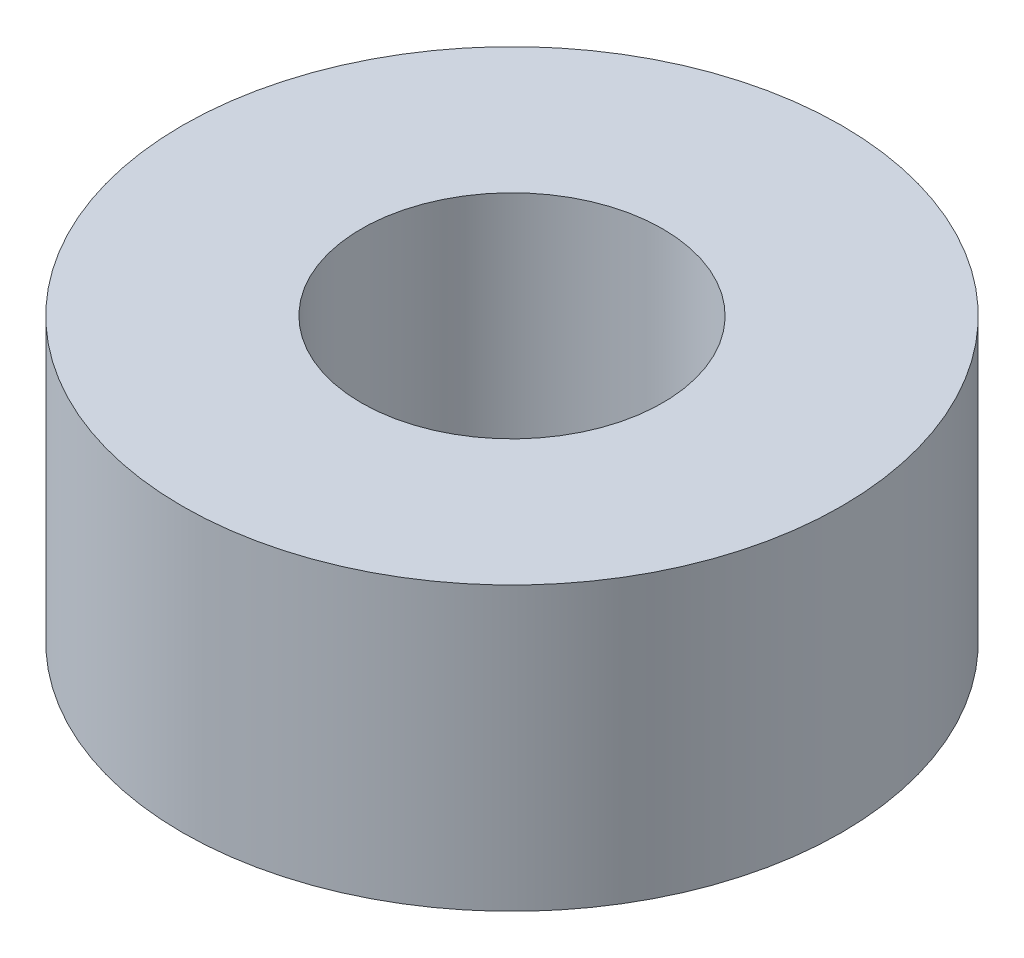
ISO-10303-21;
HEADER;
FILE_DESCRIPTION(('STEP AP214'),'2;1');
FILE_NAME('part.step','',(''),(''),'','','');
FILE_SCHEMA(('AUTOMOTIVE_DESIGN { 1 0 10303 214 1 1 1 1 }'));
ENDSEC;
DATA;
#1=APPLICATION_CONTEXT('core data for automotive mechanical design processes');
#2=APPLICATION_PROTOCOL_DEFINITION('international standard','automotive_design',2000,#1);
#3=PRODUCT_CONTEXT('',#1,'mechanical');
#4=PRODUCT('Part','Part','',(#3));
#5=PRODUCT_RELATED_PRODUCT_CATEGORY('part','',(#4));
#6=PRODUCT_DEFINITION_FORMATION('','',#4);
#7=PRODUCT_DEFINITION_CONTEXT('part definition',#1,'design');
#8=PRODUCT_DEFINITION('design','',#6,#7);
#9=PRODUCT_DEFINITION_SHAPE('','',#8);
#10=(LENGTH_UNIT() NAMED_UNIT(*) SI_UNIT(.MILLI.,.METRE.));
#11=(NAMED_UNIT(*) PLANE_ANGLE_UNIT() SI_UNIT($,.RADIAN.));
#12=(NAMED_UNIT(*) SI_UNIT($,.STERADIAN.) SOLID_ANGLE_UNIT());
#13=UNCERTAINTY_MEASURE_WITH_UNIT(LENGTH_MEASURE(1.E-05),#10,'distance_accuracy_value','');
#14=(GEOMETRIC_REPRESENTATION_CONTEXT(3) GLOBAL_UNCERTAINTY_ASSIGNED_CONTEXT((#13)) GLOBAL_UNIT_ASSIGNED_CONTEXT((#10,
#11,#12)) REPRESENTATION_CONTEXT('',''));
#15=CARTESIAN_POINT('',(0.,0.,0.));
#16=DIRECTION('',(0.,0.,1.));
#17=DIRECTION('',(1.,0.,0.));
#18=AXIS2_PLACEMENT_3D('',#15,#16,#17);
#19=CARTESIAN_POINT('',(0.,3.,0.));
#20=DIRECTION('',(0.,1.,0.));
#21=DIRECTION('',(0.,0.,1.));
#22=AXIS2_PLACEMENT_3D('',#19,#20,#21);
#23=PLANE('',#22);
#24=CARTESIAN_POINT('',(0.,3.,0.));
#25=DIRECTION('',(0.,1.,0.));
#26=DIRECTION('',(0.,0.,1.));
#27=AXIS2_PLACEMENT_3D('',#24,#25,#26);
#28=CIRCLE('',#27,3.5);
#29=CARTESIAN_POINT('',(0.,3.,3.5));
#30=VERTEX_POINT('',#29);
#31=EDGE_CURVE('E10',#30,#30,#28,.T.);
#32=ORIENTED_EDGE('',*,*,#31,.T.);
#33=EDGE_LOOP('',(#32));
#34=FACE_BOUND('',#33,.T.);
#35=CARTESIAN_POINT('',(0.,3.,0.));
#36=DIRECTION('',(0.,1.,0.));
#37=DIRECTION('',(0.,0.,1.));
#38=AXIS2_PLACEMENT_3D('',#35,#36,#37);
#39=CIRCLE('',#38,1.6);
#40=CARTESIAN_POINT('',(0.,3.,1.6));
#41=VERTEX_POINT('',#40);
#42=EDGE_CURVE('E50',#41,#41,#39,.T.);
#43=ORIENTED_EDGE('',*,*,#42,.F.);
#44=EDGE_LOOP('',(#43));
#45=FACE_BOUND('',#44,.T.);
#46=ADVANCED_FACE('F37',(#34,#45),#23,.T.);
#47=CARTESIAN_POINT('',(0.,0.,0.));
#48=DIRECTION('',(0.,1.,0.));
#49=DIRECTION('',(0.,0.,1.));
#50=AXIS2_PLACEMENT_3D('',#47,#48,#49);
#51=PLANE('',#50);
#52=CARTESIAN_POINT('',(0.,0.,0.));
#53=DIRECTION('',(0.,1.,0.));
#54=DIRECTION('',(0.,0.,1.));
#55=AXIS2_PLACEMENT_3D('',#52,#53,#54);
#56=CIRCLE('',#55,3.5);
#57=CARTESIAN_POINT('',(0.,0.,3.5));
#58=VERTEX_POINT('',#57);
#59=EDGE_CURVE('E41',#58,#58,#56,.T.);
#60=ORIENTED_EDGE('',*,*,#59,.F.);
#61=EDGE_LOOP('',(#60));
#62=FACE_BOUND('',#61,.T.);
#63=CARTESIAN_POINT('',(0.,0.,0.));
#64=DIRECTION('',(0.,1.,0.));
#65=DIRECTION('',(0.,0.,1.));
#66=AXIS2_PLACEMENT_3D('',#63,#64,#65);
#67=CIRCLE('',#66,1.6);
#68=CARTESIAN_POINT('',(0.,0.,1.6));
#69=VERTEX_POINT('',#68);
#70=EDGE_CURVE('E52',#69,#69,#67,.T.);
#71=ORIENTED_EDGE('',*,*,#70,.T.);
#72=EDGE_LOOP('',(#71));
#73=FACE_BOUND('',#72,.T.);
#74=ADVANCED_FACE('F64',(#62,#73),#51,.F.);
#75=CARTESIAN_POINT('',(0.,3.,0.));
#76=DIRECTION('',(0.,-1.,0.));
#77=DIRECTION('',(0.,0.,-1.));
#78=AXIS2_PLACEMENT_3D('',#75,#76,#77);
#79=CYLINDRICAL_SURFACE('',#78,3.5);
#80=ORIENTED_EDGE('',*,*,#31,.F.);
#81=EDGE_LOOP('',(#80));
#82=FACE_BOUND('',#81,.T.);
#83=ORIENTED_EDGE('',*,*,#59,.T.);
#84=EDGE_LOOP('',(#83));
#85=FACE_BOUND('',#84,.T.);
#86=ADVANCED_FACE('F39',(#82,#85),#79,.T.);
#87=CARTESIAN_POINT('',(0.,3.,0.));
#88=DIRECTION('',(0.,-1.,0.));
#89=DIRECTION('',(0.,0.,-1.));
#90=AXIS2_PLACEMENT_3D('',#87,#88,#89);
#91=CYLINDRICAL_SURFACE('',#90,1.6);
#92=ORIENTED_EDGE('',*,*,#42,.T.);
#93=EDGE_LOOP('',(#92));
#94=FACE_BOUND('',#93,.T.);
#95=ORIENTED_EDGE('',*,*,#70,.F.);
#96=EDGE_LOOP('',(#95));
#97=FACE_BOUND('',#96,.T.);
#98=ADVANCED_FACE('F60',(#94,#97),#91,.F.);
#99=CLOSED_SHELL('',(#46,#74,#86,#98));
#100=MANIFOLD_SOLID_BREP('B2',#99);
#101=ADVANCED_BREP_SHAPE_REPRESENTATION('',(#18,#100),#14);
#102=SHAPE_DEFINITION_REPRESENTATION(#9,#101);
ENDSEC;
END-ISO-10303-21;
